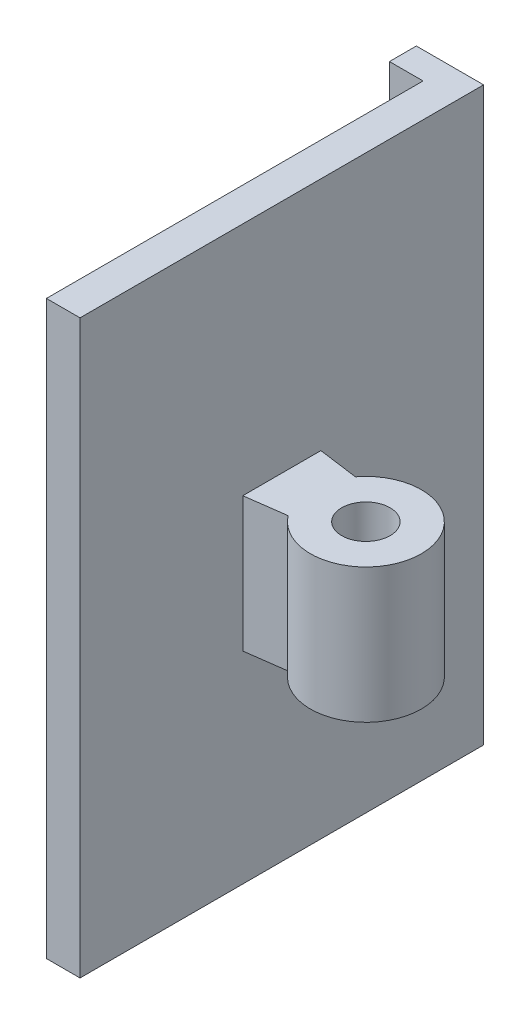
ISO-10303-21;
HEADER;
FILE_DESCRIPTION(('STEP AP214'),'2;1');
FILE_NAME('part.step','',(''),(''),'','','');
FILE_SCHEMA(('AUTOMOTIVE_DESIGN { 1 0 10303 214 1 1 1 1 }'));
ENDSEC;
DATA;
#1=APPLICATION_CONTEXT('core data for automotive mechanical design processes');
#2=APPLICATION_PROTOCOL_DEFINITION('international standard','automotive_design',2000,#1);
#3=PRODUCT_CONTEXT('',#1,'mechanical');
#4=PRODUCT('Part','Part','',(#3));
#5=PRODUCT_RELATED_PRODUCT_CATEGORY('part','',(#4));
#6=PRODUCT_DEFINITION_FORMATION('','',#4);
#7=PRODUCT_DEFINITION_CONTEXT('part definition',#1,'design');
#8=PRODUCT_DEFINITION('design','',#6,#7);
#9=PRODUCT_DEFINITION_SHAPE('','',#8);
#10=(LENGTH_UNIT() NAMED_UNIT(*) SI_UNIT(.MILLI.,.METRE.));
#11=(NAMED_UNIT(*) PLANE_ANGLE_UNIT() SI_UNIT($,.RADIAN.));
#12=(NAMED_UNIT(*) SI_UNIT($,.STERADIAN.) SOLID_ANGLE_UNIT());
#13=UNCERTAINTY_MEASURE_WITH_UNIT(LENGTH_MEASURE(1.E-05),#10,'distance_accuracy_value','');
#14=(GEOMETRIC_REPRESENTATION_CONTEXT(3) GLOBAL_UNCERTAINTY_ASSIGNED_CONTEXT((#13)) GLOBAL_UNIT_ASSIGNED_CONTEXT((#10,
#11,#12)) REPRESENTATION_CONTEXT('',''));
#15=CARTESIAN_POINT('',(0.,0.,0.));
#16=DIRECTION('',(0.,0.,1.));
#17=DIRECTION('',(1.,0.,0.));
#18=AXIS2_PLACEMENT_3D('',#15,#16,#17);
#19=CARTESIAN_POINT('',(2.5,-8.25,0.));
#20=DIRECTION('',(0.,-1.,0.));
#21=DIRECTION('',(0.,0.,-1.));
#22=AXIS2_PLACEMENT_3D('',#19,#20,#21);
#23=CYLINDRICAL_SURFACE('',#22,0.36);
#24=CARTESIAN_POINT('',(2.5,-8.25,0.));
#25=DIRECTION('',(0.,1.,0.));
#26=DIRECTION('',(0.,0.,1.));
#27=AXIS2_PLACEMENT_3D('',#24,#25,#26);
#28=CIRCLE('',#27,0.36);
#29=CARTESIAN_POINT('',(2.5,-8.25,0.360000000000001));
#30=VERTEX_POINT('',#29);
#31=EDGE_CURVE('E184',#30,#30,#28,.T.);
#32=ORIENTED_EDGE('',*,*,#31,.T.);
#33=EDGE_LOOP('',(#32));
#34=FACE_BOUND('',#33,.T.);
#35=CARTESIAN_POINT('',(2.5,-9.65,0.));
#36=DIRECTION('',(0.,-1.,0.));
#37=DIRECTION('',(0.,0.,-1.));
#38=AXIS2_PLACEMENT_3D('',#35,#36,#37);
#39=CIRCLE('',#38,0.36);
#40=CARTESIAN_POINT('',(2.5,-9.65,-0.359999999999999));
#41=VERTEX_POINT('',#40);
#42=EDGE_CURVE('E43',#41,#41,#39,.T.);
#43=ORIENTED_EDGE('',*,*,#42,.T.);
#44=EDGE_LOOP('',(#43));
#45=FACE_BOUND('',#44,.T.);
#46=ADVANCED_FACE('F39',(#34,#45),#23,.F.);
#47=CARTESIAN_POINT('',(0.750000000000001,-8.25,3.));
#48=DIRECTION('',(1.,0.,0.));
#49=DIRECTION('',(0.,0.,-1.));
#50=AXIS2_PLACEMENT_3D('',#47,#48,#49);
#51=PLANE('',#50);
#52=DIRECTION('',(0.,1.,0.));
#53=VECTOR('',#52,1.);
#54=CARTESIAN_POINT('',(0.750000000000001,-4.75,-2.6));
#55=LINE('',#54,#53);
#56=CARTESIAN_POINT('',(0.750000000000001,-13.25,-2.6));
#57=VERTEX_POINT('',#56);
#58=CARTESIAN_POINT('',(0.750000000000001,-4.75,-2.6));
#59=VERTEX_POINT('',#58);
#60=EDGE_CURVE('E55',#57,#59,#55,.T.);
#61=ORIENTED_EDGE('',*,*,#60,.F.);
#62=DIRECTION('',(0.,0.,1.));
#63=VECTOR('',#62,1.);
#64=CARTESIAN_POINT('',(0.750000000000001,-13.25,-3.));
#65=LINE('',#64,#63);
#66=CARTESIAN_POINT('',(0.750000000000001,-13.25,3.));
#67=VERTEX_POINT('',#66);
#68=EDGE_CURVE('E169',#57,#67,#65,.T.);
#69=ORIENTED_EDGE('',*,*,#68,.T.);
#70=DIRECTION('',(0.,-1.,0.));
#71=VECTOR('',#70,1.);
#72=CARTESIAN_POINT('',(0.750000000000001,-8.25,3.));
#73=LINE('',#72,#71);
#74=CARTESIAN_POINT('',(0.750000000000001,-4.75,3.));
#75=VERTEX_POINT('',#74);
#76=EDGE_CURVE('E204',#75,#67,#73,.T.);
#77=ORIENTED_EDGE('',*,*,#76,.F.);
#78=DIRECTION('',(0.,0.,1.));
#79=VECTOR('',#78,1.);
#80=CARTESIAN_POINT('',(0.750000000000001,-4.75,-3.));
#81=LINE('',#80,#79);
#82=EDGE_CURVE('E164',#59,#75,#81,.T.);
#83=ORIENTED_EDGE('',*,*,#82,.F.);
#84=EDGE_LOOP('',(#61,#69,#77,#83));
#85=FACE_BOUND('',#84,.T.);
#86=ADVANCED_FACE('F235',(#85),#51,.F.);
#87=CARTESIAN_POINT('',(2.5,-8.25,0.));
#88=DIRECTION('',(0.,1.,0.));
#89=DIRECTION('',(0.,0.,1.));
#90=AXIS2_PLACEMENT_3D('',#87,#88,#89);
#91=PLANE('',#90);
#92=DIRECTION('',(0.,0.,-1.));
#93=VECTOR('',#92,1.);
#94=CARTESIAN_POINT('',(1.25,-8.25,0.));
#95=LINE('',#94,#93);
#96=CARTESIAN_POINT('',(1.25,-8.25,0.580511210534834));
#97=VERTEX_POINT('',#96);
#98=CARTESIAN_POINT('',(1.25,-8.25,-0.580511210534833));
#99=VERTEX_POINT('',#98);
#100=EDGE_CURVE('E181',#97,#99,#95,.T.);
#101=ORIENTED_EDGE('',*,*,#100,.F.);
#102=DIRECTION('',(0.990932376959291,0.,-0.134361543210135));
#103=VECTOR('',#102,1.);
#104=CARTESIAN_POINT('',(1.84377976257967,-8.25,0.500000000000001));
#105=LINE('',#104,#103);
#106=CARTESIAN_POINT('',(1.84377976257967,-8.25,0.500000000000001));
#107=VERTEX_POINT('',#106);
#108=EDGE_CURVE('E64',#97,#107,#105,.T.);
#109=ORIENTED_EDGE('',*,*,#108,.T.);
#110=CARTESIAN_POINT('',(2.5,-8.25,0.));
#111=DIRECTION('',(0.,1.,0.));
#112=DIRECTION('',(0.,0.,1.));
#113=AXIS2_PLACEMENT_3D('',#110,#111,#112);
#114=CIRCLE('',#113,0.824999999999999);
#115=CARTESIAN_POINT('',(1.84377976257967,-8.25,-0.499999999999999));
#116=VERTEX_POINT('',#115);
#117=EDGE_CURVE('E188',#107,#116,#114,.T.);
#118=ORIENTED_EDGE('',*,*,#117,.T.);
#119=DIRECTION('',(-0.990932376959291,0.,-0.134361543210137));
#120=VECTOR('',#119,1.);
#121=CARTESIAN_POINT('',(1.25,-8.25,-0.580511210534833));
#122=LINE('',#121,#120);
#123=EDGE_CURVE('E86',#116,#99,#122,.T.);
#124=ORIENTED_EDGE('',*,*,#123,.T.);
#125=EDGE_LOOP('',(#101,#109,#118,#124));
#126=FACE_BOUND('',#125,.T.);
#127=ORIENTED_EDGE('',*,*,#31,.F.);
#128=EDGE_LOOP('',(#127));
#129=FACE_BOUND('',#128,.T.);
#130=ADVANCED_FACE('F243',(#126,#129),#91,.T.);
#131=CARTESIAN_POINT('',(2.5,-10.25,0.));
#132=DIRECTION('',(0.,1.,0.));
#133=DIRECTION('',(0.,0.,1.));
#134=AXIS2_PLACEMENT_3D('',#131,#132,#133);
#135=PLANE('',#134);
#136=CARTESIAN_POINT('',(2.5,-10.25,0.));
#137=DIRECTION('',(0.,-1.,0.));
#138=DIRECTION('',(0.,0.,-1.));
#139=AXIS2_PLACEMENT_3D('',#136,#137,#138);
#140=CIRCLE('',#139,0.45);
#141=CARTESIAN_POINT('',(2.5,-10.25,-0.449999999999999));
#142=VERTEX_POINT('',#141);
#143=EDGE_CURVE('E155',#142,#142,#140,.T.);
#144=ORIENTED_EDGE('',*,*,#143,.F.);
#145=EDGE_LOOP('',(#144));
#146=FACE_BOUND('',#145,.T.);
#147=DIRECTION('',(0.990932376959291,0.,-0.134361543210135));
#148=VECTOR('',#147,1.);
#149=CARTESIAN_POINT('',(1.84377976257967,-10.25,0.500000000000001));
#150=LINE('',#149,#148);
#151=CARTESIAN_POINT('',(1.25,-10.25,0.580511210534834));
#152=VERTEX_POINT('',#151);
#153=CARTESIAN_POINT('',(1.84377976257967,-10.25,0.500000000000001));
#154=VERTEX_POINT('',#153);
#155=EDGE_CURVE('E79',#152,#154,#150,.T.);
#156=ORIENTED_EDGE('',*,*,#155,.F.);
#157=DIRECTION('',(0.,0.,-1.));
#158=VECTOR('',#157,1.);
#159=CARTESIAN_POINT('',(1.25,-10.25,0.));
#160=LINE('',#159,#158);
#161=CARTESIAN_POINT('',(1.25,-10.25,-0.580511210534833));
#162=VERTEX_POINT('',#161);
#163=EDGE_CURVE('E179',#152,#162,#160,.T.);
#164=ORIENTED_EDGE('',*,*,#163,.T.);
#165=DIRECTION('',(-0.990932376959291,0.,-0.134361543210137));
#166=VECTOR('',#165,1.);
#167=CARTESIAN_POINT('',(1.25,-10.25,-0.580511210534833));
#168=LINE('',#167,#166);
#169=CARTESIAN_POINT('',(1.84377976257967,-10.25,-0.499999999999999));
#170=VERTEX_POINT('',#169);
#171=EDGE_CURVE('E195',#170,#162,#168,.T.);
#172=ORIENTED_EDGE('',*,*,#171,.F.);
#173=CARTESIAN_POINT('',(2.5,-10.25,0.));
#174=DIRECTION('',(0.,1.,0.));
#175=DIRECTION('',(0.,0.,1.));
#176=AXIS2_PLACEMENT_3D('',#173,#174,#175);
#177=CIRCLE('',#176,0.824999999999999);
#178=EDGE_CURVE('E187',#154,#170,#177,.T.);
#179=ORIENTED_EDGE('',*,*,#178,.F.);
#180=EDGE_LOOP('',(#156,#164,#172,#179));
#181=FACE_BOUND('',#180,.T.);
#182=ADVANCED_FACE('F217',(#146,#181),#135,.F.);
#183=CARTESIAN_POINT('',(2.5,-8.25,0.));
#184=DIRECTION('',(0.,-1.,0.));
#185=DIRECTION('',(0.,0.,-1.));
#186=AXIS2_PLACEMENT_3D('',#183,#184,#185);
#187=CYLINDRICAL_SURFACE('',#186,0.824999999999999);
#188=ORIENTED_EDGE('',*,*,#178,.T.);
#189=DIRECTION('',(0.,-1.,0.));
#190=VECTOR('',#189,1.);
#191=CARTESIAN_POINT('',(1.84377976257967,-8.25,-0.499999999999999));
#192=LINE('',#191,#190);
#193=EDGE_CURVE('E11',#116,#170,#192,.T.);
#194=ORIENTED_EDGE('',*,*,#193,.F.);
#195=ORIENTED_EDGE('',*,*,#117,.F.);
#196=DIRECTION('',(0.,-1.,0.));
#197=VECTOR('',#196,1.);
#198=CARTESIAN_POINT('',(1.84377976257967,-8.25,0.500000000000001));
#199=LINE('',#198,#197);
#200=EDGE_CURVE('E192',#107,#154,#199,.T.);
#201=ORIENTED_EDGE('',*,*,#200,.T.);
#202=EDGE_LOOP('',(#188,#194,#195,#201));
#203=FACE_BOUND('',#202,.T.);
#204=ADVANCED_FACE('F41',(#203),#187,.T.);
#205=CARTESIAN_POINT('',(1.25,-8.25,-0.580511210534833));
#206=DIRECTION('',(-0.134361543210137,0.,0.990932376959291));
#207=DIRECTION('',(0.990932376959291,0.,0.134361543210137));
#208=AXIS2_PLACEMENT_3D('',#205,#206,#207);
#209=PLANE('',#208);
#210=ORIENTED_EDGE('',*,*,#171,.T.);
#211=DIRECTION('',(0.,-1.,0.));
#212=VECTOR('',#211,1.);
#213=CARTESIAN_POINT('',(1.25,-8.25,-0.580511210534833));
#214=LINE('',#213,#212);
#215=EDGE_CURVE('E48',#99,#162,#214,.T.);
#216=ORIENTED_EDGE('',*,*,#215,.F.);
#217=ORIENTED_EDGE('',*,*,#123,.F.);
#218=ORIENTED_EDGE('',*,*,#193,.T.);
#219=EDGE_LOOP('',(#210,#216,#217,#218));
#220=FACE_BOUND('',#219,.T.);
#221=ADVANCED_FACE('F213',(#220),#209,.F.);
#222=CARTESIAN_POINT('',(0.750000000000001,-8.25,-3.));
#223=DIRECTION('',(0.,0.,1.));
#224=DIRECTION('',(1.,0.,0.));
#225=AXIS2_PLACEMENT_3D('',#222,#223,#224);
#226=PLANE('',#225);
#227=DIRECTION('',(0.,-1.,0.));
#228=VECTOR('',#227,1.);
#229=CARTESIAN_POINT('',(1.25,-8.25,-3.));
#230=LINE('',#229,#228);
#231=CARTESIAN_POINT('',(1.25,-4.75,-3.));
#232=VERTEX_POINT('',#231);
#233=CARTESIAN_POINT('',(1.25,-13.25,-3.));
#234=VERTEX_POINT('',#233);
#235=EDGE_CURVE('E132',#232,#234,#230,.T.);
#236=ORIENTED_EDGE('',*,*,#235,.T.);
#237=DIRECTION('',(-1.,0.,0.));
#238=VECTOR('',#237,1.);
#239=CARTESIAN_POINT('',(1.25,-13.25,-3.));
#240=LINE('',#239,#238);
#241=CARTESIAN_POINT('',(0.250000000000001,-13.25,-3.));
#242=VERTEX_POINT('',#241);
#243=EDGE_CURVE('E126',#234,#242,#240,.T.);
#244=ORIENTED_EDGE('',*,*,#243,.T.);
#245=DIRECTION('',(0.,-1.,0.));
#246=VECTOR('',#245,1.);
#247=CARTESIAN_POINT('',(0.250000000000001,-4.75,-3.));
#248=LINE('',#247,#246);
#249=CARTESIAN_POINT('',(0.250000000000001,-4.75,-3.));
#250=VERTEX_POINT('',#249);
#251=EDGE_CURVE('E131',#250,#242,#248,.T.);
#252=ORIENTED_EDGE('',*,*,#251,.F.);
#253=DIRECTION('',(-1.,0.,0.));
#254=VECTOR('',#253,1.);
#255=CARTESIAN_POINT('',(1.25,-4.75,-3.));
#256=LINE('',#255,#254);
#257=EDGE_CURVE('E137',#232,#250,#256,.T.);
#258=ORIENTED_EDGE('',*,*,#257,.F.);
#259=EDGE_LOOP('',(#236,#244,#252,#258));
#260=FACE_BOUND('',#259,.T.);
#261=ADVANCED_FACE('F128',(#260),#226,.F.);
#262=CARTESIAN_POINT('',(1.25,-8.25,3.));
#263=DIRECTION('',(0.,0.,-1.));
#264=DIRECTION('',(-1.,0.,0.));
#265=AXIS2_PLACEMENT_3D('',#262,#263,#264);
#266=PLANE('',#265);
#267=ORIENTED_EDGE('',*,*,#76,.T.);
#268=DIRECTION('',(-1.,0.,0.));
#269=VECTOR('',#268,1.);
#270=CARTESIAN_POINT('',(1.25,-13.25,3.));
#271=LINE('',#270,#269);
#272=CARTESIAN_POINT('',(1.25,-13.25,3.));
#273=VERTEX_POINT('',#272);
#274=EDGE_CURVE('E136',#273,#67,#271,.T.);
#275=ORIENTED_EDGE('',*,*,#274,.F.);
#276=DIRECTION('',(0.,-1.,0.));
#277=VECTOR('',#276,1.);
#278=CARTESIAN_POINT('',(1.25,-8.25,3.));
#279=LINE('',#278,#277);
#280=CARTESIAN_POINT('',(1.25,-4.75,3.));
#281=VERTEX_POINT('',#280);
#282=EDGE_CURVE('E202',#281,#273,#279,.T.);
#283=ORIENTED_EDGE('',*,*,#282,.F.);
#284=DIRECTION('',(-1.,0.,0.));
#285=VECTOR('',#284,1.);
#286=CARTESIAN_POINT('',(1.25,-4.75,3.));
#287=LINE('',#286,#285);
#288=EDGE_CURVE('E176',#281,#75,#287,.T.);
#289=ORIENTED_EDGE('',*,*,#288,.T.);
#290=EDGE_LOOP('',(#267,#275,#283,#289));
#291=FACE_BOUND('',#290,.T.);
#292=ADVANCED_FACE('F231',(#291),#266,.F.);
#293=CARTESIAN_POINT('',(1.25,-8.25,0.580511210534834));
#294=DIRECTION('',(-1.,0.,0.));
#295=DIRECTION('',(0.,0.,1.));
#296=AXIS2_PLACEMENT_3D('',#293,#294,#295);
#297=PLANE('',#296);
#298=DIRECTION('',(0.,-1.,0.));
#299=VECTOR('',#298,1.);
#300=CARTESIAN_POINT('',(1.25,-8.25,0.580511210534834));
#301=LINE('',#300,#299);
#302=EDGE_CURVE('E200',#97,#152,#301,.T.);
#303=ORIENTED_EDGE('',*,*,#302,.F.);
#304=ORIENTED_EDGE('',*,*,#100,.T.);
#305=ORIENTED_EDGE('',*,*,#215,.T.);
#306=ORIENTED_EDGE('',*,*,#163,.F.);
#307=EDGE_LOOP('',(#303,#304,#305,#306));
#308=FACE_BOUND('',#307,.T.);
#309=ORIENTED_EDGE('',*,*,#282,.T.);
#310=DIRECTION('',(0.,0.,1.));
#311=VECTOR('',#310,1.);
#312=CARTESIAN_POINT('',(1.25,-13.25,-3.));
#313=LINE('',#312,#311);
#314=EDGE_CURVE('E168',#234,#273,#313,.T.);
#315=ORIENTED_EDGE('',*,*,#314,.F.);
#316=ORIENTED_EDGE('',*,*,#235,.F.);
#317=DIRECTION('',(0.,0.,1.));
#318=VECTOR('',#317,1.);
#319=CARTESIAN_POINT('',(1.25,-4.75,-3.));
#320=LINE('',#319,#318);
#321=EDGE_CURVE('E165',#232,#281,#320,.T.);
#322=ORIENTED_EDGE('',*,*,#321,.T.);
#323=EDGE_LOOP('',(#309,#315,#316,#322));
#324=FACE_BOUND('',#323,.T.);
#325=ADVANCED_FACE('F211',(#308,#324),#297,.F.);
#326=CARTESIAN_POINT('',(1.84377976257967,-8.25,0.500000000000001));
#327=DIRECTION('',(-0.134361543210135,0.,-0.990932376959291));
#328=DIRECTION('',(-0.990932376959291,0.,0.134361543210135));
#329=AXIS2_PLACEMENT_3D('',#326,#327,#328);
#330=PLANE('',#329);
#331=ORIENTED_EDGE('',*,*,#155,.T.);
#332=ORIENTED_EDGE('',*,*,#200,.F.);
#333=ORIENTED_EDGE('',*,*,#108,.F.);
#334=ORIENTED_EDGE('',*,*,#302,.T.);
#335=EDGE_LOOP('',(#331,#332,#333,#334));
#336=FACE_BOUND('',#335,.T.);
#337=ADVANCED_FACE('F220',(#336),#330,.F.);
#338=CARTESIAN_POINT('',(1.25,-13.25,-3.));
#339=DIRECTION('',(0.,-1.,0.));
#340=DIRECTION('',(1.,0.,0.));
#341=AXIS2_PLACEMENT_3D('',#338,#339,#340);
#342=PLANE('',#341);
#343=ORIENTED_EDGE('',*,*,#68,.F.);
#344=DIRECTION('',(1.,0.,0.));
#345=VECTOR('',#344,1.);
#346=CARTESIAN_POINT('',(0.250000000000001,-13.25,-2.6));
#347=LINE('',#346,#345);
#348=CARTESIAN_POINT('',(0.250000000000001,-13.25,-2.6));
#349=VERTEX_POINT('',#348);
#350=EDGE_CURVE('E143',#349,#57,#347,.T.);
#351=ORIENTED_EDGE('',*,*,#350,.F.);
#352=DIRECTION('',(0.,0.,1.));
#353=VECTOR('',#352,1.);
#354=CARTESIAN_POINT('',(0.250000000000001,-13.25,-3.));
#355=LINE('',#354,#353);
#356=EDGE_CURVE('E140',#242,#349,#355,.T.);
#357=ORIENTED_EDGE('',*,*,#356,.F.);
#358=ORIENTED_EDGE('',*,*,#243,.F.);
#359=ORIENTED_EDGE('',*,*,#314,.T.);
#360=ORIENTED_EDGE('',*,*,#274,.T.);
#361=EDGE_LOOP('',(#343,#351,#357,#358,#359,#360));
#362=FACE_BOUND('',#361,.T.);
#363=ADVANCED_FACE('F141',(#362),#342,.T.);
#364=CARTESIAN_POINT('',(1.25,-4.75,-3.));
#365=DIRECTION('',(0.,-1.,0.));
#366=DIRECTION('',(1.,0.,0.));
#367=AXIS2_PLACEMENT_3D('',#364,#365,#366);
#368=PLANE('',#367);
#369=ORIENTED_EDGE('',*,*,#257,.T.);
#370=DIRECTION('',(0.,0.,-1.));
#371=VECTOR('',#370,1.);
#372=CARTESIAN_POINT('',(0.250000000000001,-4.75,-3.));
#373=LINE('',#372,#371);
#374=CARTESIAN_POINT('',(0.250000000000001,-4.75,-2.6));
#375=VERTEX_POINT('',#374);
#376=EDGE_CURVE('E151',#375,#250,#373,.T.);
#377=ORIENTED_EDGE('',*,*,#376,.F.);
#378=DIRECTION('',(1.,0.,0.));
#379=VECTOR('',#378,1.);
#380=CARTESIAN_POINT('',(0.250000000000001,-4.75,-2.6));
#381=LINE('',#380,#379);
#382=EDGE_CURVE('E159',#375,#59,#381,.T.);
#383=ORIENTED_EDGE('',*,*,#382,.T.);
#384=ORIENTED_EDGE('',*,*,#82,.T.);
#385=ORIENTED_EDGE('',*,*,#288,.F.);
#386=ORIENTED_EDGE('',*,*,#321,.F.);
#387=EDGE_LOOP('',(#369,#377,#383,#384,#385,#386));
#388=FACE_BOUND('',#387,.T.);
#389=ADVANCED_FACE('F229',(#388),#368,.F.);
#390=CARTESIAN_POINT('',(0.250000000000001,-4.75,-2.6));
#391=DIRECTION('',(0.,0.,-1.));
#392=DIRECTION('',(0.,1.,0.));
#393=AXIS2_PLACEMENT_3D('',#390,#391,#392);
#394=PLANE('',#393);
#395=ORIENTED_EDGE('',*,*,#60,.T.);
#396=ORIENTED_EDGE('',*,*,#382,.F.);
#397=DIRECTION('',(0.,1.,0.));
#398=VECTOR('',#397,1.);
#399=CARTESIAN_POINT('',(0.250000000000001,-4.75,-2.6));
#400=LINE('',#399,#398);
#401=EDGE_CURVE('E146',#349,#375,#400,.T.);
#402=ORIENTED_EDGE('',*,*,#401,.F.);
#403=ORIENTED_EDGE('',*,*,#350,.T.);
#404=EDGE_LOOP('',(#395,#396,#402,#403));
#405=FACE_BOUND('',#404,.T.);
#406=ADVANCED_FACE('F278',(#405),#394,.F.);
#407=CARTESIAN_POINT('',(0.250000000000001,0.,0.));
#408=DIRECTION('',(-1.,0.,0.));
#409=DIRECTION('',(0.,0.,1.));
#410=AXIS2_PLACEMENT_3D('',#407,#408,#409);
#411=PLANE('',#410);
#412=ORIENTED_EDGE('',*,*,#251,.T.);
#413=ORIENTED_EDGE('',*,*,#356,.T.);
#414=ORIENTED_EDGE('',*,*,#401,.T.);
#415=ORIENTED_EDGE('',*,*,#376,.T.);
#416=EDGE_LOOP('',(#412,#413,#414,#415));
#417=FACE_BOUND('',#416,.T.);
#418=ADVANCED_FACE('F149',(#417),#411,.T.);
#419=CARTESIAN_POINT('',(2.5,-9.65,0.));
#420=DIRECTION('',(0.,-1.,0.));
#421=DIRECTION('',(0.,0.,-1.));
#422=AXIS2_PLACEMENT_3D('',#419,#420,#421);
#423=CYLINDRICAL_SURFACE('',#422,0.45);
#424=CARTESIAN_POINT('',(2.5,-9.65,0.));
#425=DIRECTION('',(0.,-1.,0.));
#426=DIRECTION('',(0.,0.,-1.));
#427=AXIS2_PLACEMENT_3D('',#424,#425,#426);
#428=CIRCLE('',#427,0.45);
#429=CARTESIAN_POINT('',(2.5,-9.65,-0.449999999999999));
#430=VERTEX_POINT('',#429);
#431=EDGE_CURVE('E258',#430,#430,#428,.T.);
#432=ORIENTED_EDGE('',*,*,#431,.F.);
#433=EDGE_LOOP('',(#432));
#434=FACE_BOUND('',#433,.T.);
#435=ORIENTED_EDGE('',*,*,#143,.T.);
#436=EDGE_LOOP('',(#435));
#437=FACE_BOUND('',#436,.T.);
#438=ADVANCED_FACE('F267',(#434,#437),#423,.F.);
#439=CARTESIAN_POINT('',(2.5,-9.65,0.));
#440=DIRECTION('',(0.,-1.,0.));
#441=DIRECTION('',(0.,0.,-1.));
#442=AXIS2_PLACEMENT_3D('',#439,#440,#441);
#443=PLANE('',#442);
#444=ORIENTED_EDGE('',*,*,#42,.F.);
#445=EDGE_LOOP('',(#444));
#446=FACE_BOUND('',#445,.T.);
#447=ORIENTED_EDGE('',*,*,#431,.T.);
#448=EDGE_LOOP('',(#447));
#449=FACE_BOUND('',#448,.T.);
#450=ADVANCED_FACE('F265',(#446,#449),#443,.T.);
#451=CLOSED_SHELL('',(#46,#86,#130,#182,#204,#221,#261,#292,#325,#337,#363,#389,#406,#418,#438,#450));
#452=MANIFOLD_SOLID_BREP('B2',#451);
#453=ADVANCED_BREP_SHAPE_REPRESENTATION('',(#18,#452),#14);
#454=SHAPE_DEFINITION_REPRESENTATION(#9,#453);
ENDSEC;
END-ISO-10303-21;
